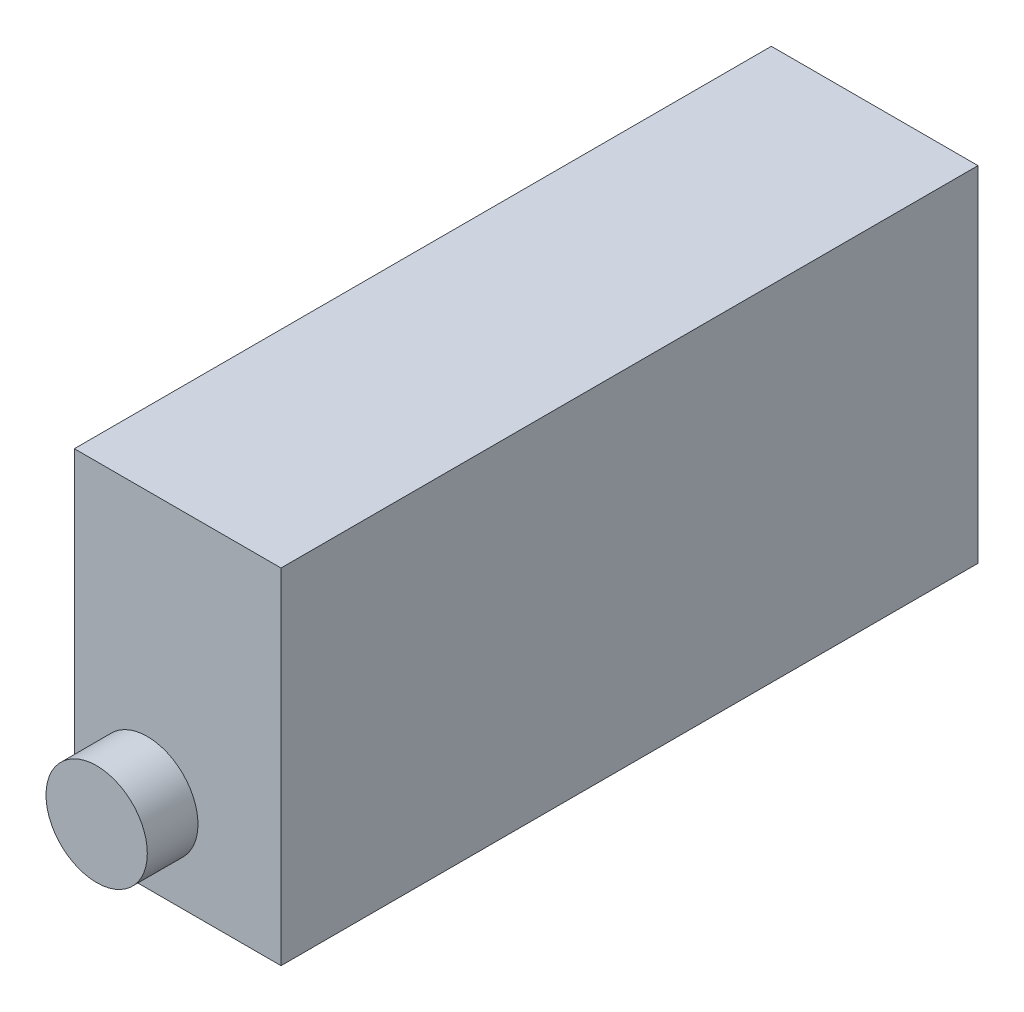
ISO-10303-21;
HEADER;
FILE_DESCRIPTION(('STEP AP214'),'2;1');
FILE_NAME('part.step','',(''),(''),'','','');
FILE_SCHEMA(('AUTOMOTIVE_DESIGN { 1 0 10303 214 1 1 1 1 }'));
ENDSEC;
DATA;
#1=APPLICATION_CONTEXT('core data for automotive mechanical design processes');
#2=APPLICATION_PROTOCOL_DEFINITION('international standard','automotive_design',2000,#1);
#3=PRODUCT_CONTEXT('',#1,'mechanical');
#4=PRODUCT('Part','Part','',(#3));
#5=PRODUCT_RELATED_PRODUCT_CATEGORY('part','',(#4));
#6=PRODUCT_DEFINITION_FORMATION('','',#4);
#7=PRODUCT_DEFINITION_CONTEXT('part definition',#1,'design');
#8=PRODUCT_DEFINITION('design','',#6,#7);
#9=PRODUCT_DEFINITION_SHAPE('','',#8);
#10=(LENGTH_UNIT() NAMED_UNIT(*) SI_UNIT(.MILLI.,.METRE.));
#11=(NAMED_UNIT(*) PLANE_ANGLE_UNIT() SI_UNIT($,.RADIAN.));
#12=(NAMED_UNIT(*) SI_UNIT($,.STERADIAN.) SOLID_ANGLE_UNIT());
#13=UNCERTAINTY_MEASURE_WITH_UNIT(LENGTH_MEASURE(1.E-05),#10,'distance_accuracy_value','');
#14=(GEOMETRIC_REPRESENTATION_CONTEXT(3) GLOBAL_UNCERTAINTY_ASSIGNED_CONTEXT((#13)) GLOBAL_UNIT_ASSIGNED_CONTEXT((#10,
#11,#12)) REPRESENTATION_CONTEXT('',''));
#15=CARTESIAN_POINT('',(0.,0.,0.));
#16=DIRECTION('',(0.,0.,1.));
#17=DIRECTION('',(1.,0.,0.));
#18=AXIS2_PLACEMENT_3D('',#15,#16,#17);
#19=CARTESIAN_POINT('',(-25.5,42.5,-172.));
#20=DIRECTION('',(-1.,0.,0.));
#21=DIRECTION('',(0.,0.,1.));
#22=AXIS2_PLACEMENT_3D('',#19,#20,#21);
#23=PLANE('',#22);
#24=DIRECTION('',(0.,-1.,0.));
#25=VECTOR('',#24,1.);
#26=CARTESIAN_POINT('',(-25.5,42.5,0.));
#27=LINE('',#26,#25);
#28=CARTESIAN_POINT('',(-25.5,42.5,0.));
#29=VERTEX_POINT('',#28);
#30=CARTESIAN_POINT('',(-25.5,-42.5,0.));
#31=VERTEX_POINT('',#30);
#32=EDGE_CURVE('E102',#29,#31,#27,.T.);
#33=ORIENTED_EDGE('',*,*,#32,.F.);
#34=DIRECTION('',(0.,0.,1.));
#35=VECTOR('',#34,1.);
#36=CARTESIAN_POINT('',(-25.5,42.5,-172.));
#37=LINE('',#36,#35);
#38=CARTESIAN_POINT('',(-25.5,42.5,-172.));
#39=VERTEX_POINT('',#38);
#40=EDGE_CURVE('E43',#39,#29,#37,.T.);
#41=ORIENTED_EDGE('',*,*,#40,.F.);
#42=DIRECTION('',(0.,-1.,0.));
#43=VECTOR('',#42,1.);
#44=CARTESIAN_POINT('',(-25.5,42.5,-172.));
#45=LINE('',#44,#43);
#46=CARTESIAN_POINT('',(-25.5,-42.5,-172.));
#47=VERTEX_POINT('',#46);
#48=EDGE_CURVE('E95',#39,#47,#45,.T.);
#49=ORIENTED_EDGE('',*,*,#48,.T.);
#50=DIRECTION('',(0.,0.,1.));
#51=VECTOR('',#50,1.);
#52=CARTESIAN_POINT('',(-25.5,-42.5,-172.));
#53=LINE('',#52,#51);
#54=EDGE_CURVE('E78',#47,#31,#53,.T.);
#55=ORIENTED_EDGE('',*,*,#54,.T.);
#56=EDGE_LOOP('',(#33,#41,#49,#55));
#57=FACE_BOUND('',#56,.T.);
#58=ADVANCED_FACE('F35',(#57),#23,.T.);
#59=CARTESIAN_POINT('',(25.5,42.5,-172.));
#60=DIRECTION('',(0.,1.,0.));
#61=DIRECTION('',(-1.,0.,0.));
#62=AXIS2_PLACEMENT_3D('',#59,#60,#61);
#63=PLANE('',#62);
#64=DIRECTION('',(-1.,0.,0.));
#65=VECTOR('',#64,1.);
#66=CARTESIAN_POINT('',(25.5,42.5,0.));
#67=LINE('',#66,#65);
#68=CARTESIAN_POINT('',(25.5,42.5,0.));
#69=VERTEX_POINT('',#68);
#70=EDGE_CURVE('E97',#69,#29,#67,.T.);
#71=ORIENTED_EDGE('',*,*,#70,.F.);
#72=DIRECTION('',(0.,0.,1.));
#73=VECTOR('',#72,1.);
#74=CARTESIAN_POINT('',(25.5,42.5,-172.));
#75=LINE('',#74,#73);
#76=CARTESIAN_POINT('',(25.5,42.5,-172.));
#77=VERTEX_POINT('',#76);
#78=EDGE_CURVE('E67',#77,#69,#75,.T.);
#79=ORIENTED_EDGE('',*,*,#78,.F.);
#80=DIRECTION('',(-1.,0.,0.));
#81=VECTOR('',#80,1.);
#82=CARTESIAN_POINT('',(25.5,42.5,-172.));
#83=LINE('',#82,#81);
#84=EDGE_CURVE('E92',#77,#39,#83,.T.);
#85=ORIENTED_EDGE('',*,*,#84,.T.);
#86=ORIENTED_EDGE('',*,*,#40,.T.);
#87=EDGE_LOOP('',(#71,#79,#85,#86));
#88=FACE_BOUND('',#87,.T.);
#89=ADVANCED_FACE('F114',(#88),#63,.T.);
#90=CARTESIAN_POINT('',(25.5,42.5,-172.));
#91=DIRECTION('',(1.,0.,0.));
#92=DIRECTION('',(0.,0.,-1.));
#93=AXIS2_PLACEMENT_3D('',#90,#91,#92);
#94=PLANE('',#93);
#95=DIRECTION('',(0.,1.,0.));
#96=VECTOR('',#95,1.);
#97=CARTESIAN_POINT('',(25.5,42.5,0.));
#98=LINE('',#97,#96);
#99=CARTESIAN_POINT('',(25.5,-42.5,0.));
#100=VERTEX_POINT('',#99);
#101=EDGE_CURVE('E86',#100,#69,#98,.T.);
#102=ORIENTED_EDGE('',*,*,#101,.F.);
#103=DIRECTION('',(0.,0.,1.));
#104=VECTOR('',#103,1.);
#105=CARTESIAN_POINT('',(25.5,-42.5,-172.));
#106=LINE('',#105,#104);
#107=CARTESIAN_POINT('',(25.5,-42.5,-172.));
#108=VERTEX_POINT('',#107);
#109=EDGE_CURVE('E81',#108,#100,#106,.T.);
#110=ORIENTED_EDGE('',*,*,#109,.F.);
#111=DIRECTION('',(0.,1.,0.));
#112=VECTOR('',#111,1.);
#113=CARTESIAN_POINT('',(25.5,42.5,-172.));
#114=LINE('',#113,#112);
#115=EDGE_CURVE('E84',#108,#77,#114,.T.);
#116=ORIENTED_EDGE('',*,*,#115,.T.);
#117=ORIENTED_EDGE('',*,*,#78,.T.);
#118=EDGE_LOOP('',(#102,#110,#116,#117));
#119=FACE_BOUND('',#118,.T.);
#120=ADVANCED_FACE('F83',(#119),#94,.T.);
#121=CARTESIAN_POINT('',(25.5,-42.5,-172.));
#122=DIRECTION('',(0.,-1.,0.));
#123=DIRECTION('',(0.,0.,-1.));
#124=AXIS2_PLACEMENT_3D('',#121,#122,#123);
#125=PLANE('',#124);
#126=DIRECTION('',(1.,0.,0.));
#127=VECTOR('',#126,1.);
#128=CARTESIAN_POINT('',(25.5,-42.5,0.));
#129=LINE('',#128,#127);
#130=EDGE_CURVE('E105',#31,#100,#129,.T.);
#131=ORIENTED_EDGE('',*,*,#130,.F.);
#132=ORIENTED_EDGE('',*,*,#54,.F.);
#133=DIRECTION('',(1.,0.,0.));
#134=VECTOR('',#133,1.);
#135=CARTESIAN_POINT('',(25.5,-42.5,-172.));
#136=LINE('',#135,#134);
#137=EDGE_CURVE('E91',#47,#108,#136,.T.);
#138=ORIENTED_EDGE('',*,*,#137,.T.);
#139=ORIENTED_EDGE('',*,*,#109,.T.);
#140=EDGE_LOOP('',(#131,#132,#138,#139));
#141=FACE_BOUND('',#140,.T.);
#142=ADVANCED_FACE('F94',(#141),#125,.T.);
#143=CARTESIAN_POINT('',(0.,0.,-172.));
#144=DIRECTION('',(0.,0.,-1.));
#145=DIRECTION('',(-1.,0.,0.));
#146=AXIS2_PLACEMENT_3D('',#143,#144,#145);
#147=PLANE('',#146);
#148=ORIENTED_EDGE('',*,*,#48,.F.);
#149=ORIENTED_EDGE('',*,*,#84,.F.);
#150=ORIENTED_EDGE('',*,*,#115,.F.);
#151=ORIENTED_EDGE('',*,*,#137,.F.);
#152=EDGE_LOOP('',(#148,#149,#150,#151));
#153=FACE_BOUND('',#152,.T.);
#154=ADVANCED_FACE('F90',(#153),#147,.T.);
#155=CARTESIAN_POINT('',(0.,0.,0.));
#156=DIRECTION('',(0.,0.,-1.));
#157=DIRECTION('',(-1.,0.,0.));
#158=AXIS2_PLACEMENT_3D('',#155,#156,#157);
#159=PLANE('',#158);
#160=CARTESIAN_POINT('',(-7.5,-22.5,0.));
#161=DIRECTION('',(0.,0.,-1.));
#162=DIRECTION('',(-1.,0.,0.));
#163=AXIS2_PLACEMENT_3D('',#160,#161,#162);
#164=CIRCLE('',#163,12.5);
#165=CARTESIAN_POINT('',(-20.,-22.5,0.));
#166=VERTEX_POINT('',#165);
#167=EDGE_CURVE('E11',#166,#166,#164,.F.);
#168=ORIENTED_EDGE('',*,*,#167,.F.);
#169=EDGE_LOOP('',(#168));
#170=FACE_BOUND('',#169,.T.);
#171=ORIENTED_EDGE('',*,*,#32,.T.);
#172=ORIENTED_EDGE('',*,*,#130,.T.);
#173=ORIENTED_EDGE('',*,*,#101,.T.);
#174=ORIENTED_EDGE('',*,*,#70,.T.);
#175=EDGE_LOOP('',(#171,#172,#173,#174));
#176=FACE_BOUND('',#175,.T.);
#177=ADVANCED_FACE('F113',(#170,#176),#159,.F.);
#178=CARTESIAN_POINT('',(-7.5,-22.5,12.5));
#179=DIRECTION('',(0.,0.,-1.));
#180=DIRECTION('',(-1.,0.,0.));
#181=AXIS2_PLACEMENT_3D('',#178,#179,#180);
#182=CYLINDRICAL_SURFACE('',#181,12.5);
#183=CARTESIAN_POINT('',(-7.5,-22.5,12.5));
#184=DIRECTION('',(0.,0.,1.));
#185=DIRECTION('',(1.,0.,0.));
#186=AXIS2_PLACEMENT_3D('',#183,#184,#185);
#187=CIRCLE('',#186,12.5);
#188=CARTESIAN_POINT('',(5.,-22.5,12.5));
#189=VERTEX_POINT('',#188);
#190=EDGE_CURVE('E106',#189,#189,#187,.T.);
#191=ORIENTED_EDGE('',*,*,#190,.F.);
#192=EDGE_LOOP('',(#191));
#193=FACE_BOUND('',#192,.T.);
#194=ORIENTED_EDGE('',*,*,#167,.T.);
#195=EDGE_LOOP('',(#194));
#196=FACE_BOUND('',#195,.T.);
#197=ADVANCED_FACE('F131',(#193,#196),#182,.T.);
#198=CARTESIAN_POINT('',(-7.5,-22.5,12.5));
#199=DIRECTION('',(0.,0.,1.));
#200=DIRECTION('',(1.,0.,0.));
#201=AXIS2_PLACEMENT_3D('',#198,#199,#200);
#202=PLANE('',#201);
#203=ORIENTED_EDGE('',*,*,#190,.T.);
#204=EDGE_LOOP('',(#203));
#205=FACE_BOUND('',#204,.T.);
#206=ADVANCED_FACE('F136',(#205),#202,.T.);
#207=CLOSED_SHELL('',(#58,#89,#120,#142,#154,#177,#197,#206));
#208=MANIFOLD_SOLID_BREP('B2',#207);
#209=ADVANCED_BREP_SHAPE_REPRESENTATION('',(#18,#208),#14);
#210=SHAPE_DEFINITION_REPRESENTATION(#9,#209);
ENDSEC;
END-ISO-10303-21;
